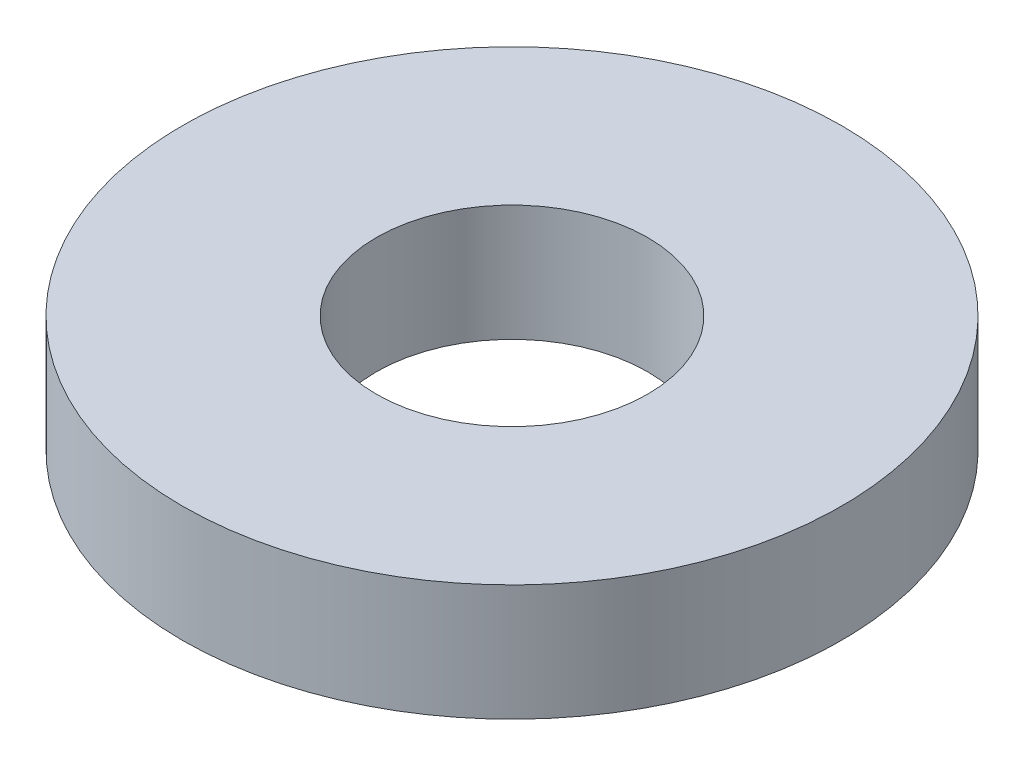
ISO-10303-21;
HEADER;
FILE_DESCRIPTION(('STEP AP214'),'2;1');
FILE_NAME('part.step','',(''),(''),'','','');
FILE_SCHEMA(('AUTOMOTIVE_DESIGN { 1 0 10303 214 1 1 1 1 }'));
ENDSEC;
DATA;
#1=APPLICATION_CONTEXT('core data for automotive mechanical design processes');
#2=APPLICATION_PROTOCOL_DEFINITION('international standard','automotive_design',2000,#1);
#3=PRODUCT_CONTEXT('',#1,'mechanical');
#4=PRODUCT('Part','Part','',(#3));
#5=PRODUCT_RELATED_PRODUCT_CATEGORY('part','',(#4));
#6=PRODUCT_DEFINITION_FORMATION('','',#4);
#7=PRODUCT_DEFINITION_CONTEXT('part definition',#1,'design');
#8=PRODUCT_DEFINITION('design','',#6,#7);
#9=PRODUCT_DEFINITION_SHAPE('','',#8);
#10=(LENGTH_UNIT() NAMED_UNIT(*) SI_UNIT(.MILLI.,.METRE.));
#11=(NAMED_UNIT(*) PLANE_ANGLE_UNIT() SI_UNIT($,.RADIAN.));
#12=(NAMED_UNIT(*) SI_UNIT($,.STERADIAN.) SOLID_ANGLE_UNIT());
#13=UNCERTAINTY_MEASURE_WITH_UNIT(LENGTH_MEASURE(1.E-05),#10,'distance_accuracy_value','');
#14=(GEOMETRIC_REPRESENTATION_CONTEXT(3) GLOBAL_UNCERTAINTY_ASSIGNED_CONTEXT((#13)) GLOBAL_UNIT_ASSIGNED_CONTEXT((#10,
#11,#12)) REPRESENTATION_CONTEXT('',''));
#15=CARTESIAN_POINT('',(0.,0.,0.));
#16=DIRECTION('',(0.,0.,1.));
#17=DIRECTION('',(1.,0.,0.));
#18=AXIS2_PLACEMENT_3D('',#15,#16,#17);
#19=CARTESIAN_POINT('',(0.,6.,0.));
#20=DIRECTION('',(0.,1.,0.));
#21=DIRECTION('',(0.,0.,1.));
#22=AXIS2_PLACEMENT_3D('',#19,#20,#21);
#23=PLANE('',#22);
#24=CARTESIAN_POINT('',(0.,6.,0.));
#25=DIRECTION('',(0.,1.,0.));
#26=DIRECTION('',(0.,0.,1.));
#27=AXIS2_PLACEMENT_3D('',#24,#25,#26);
#28=CIRCLE('',#27,17.);
#29=CARTESIAN_POINT('',(0.,6.,17.));
#30=VERTEX_POINT('',#29);
#31=EDGE_CURVE('E10',#30,#30,#28,.T.);
#32=ORIENTED_EDGE('',*,*,#31,.T.);
#33=EDGE_LOOP('',(#32));
#34=FACE_BOUND('',#33,.T.);
#35=CARTESIAN_POINT('',(0.,6.,0.));
#36=DIRECTION('',(0.,1.,0.));
#37=DIRECTION('',(0.,0.,1.));
#38=AXIS2_PLACEMENT_3D('',#35,#36,#37);
#39=CIRCLE('',#38,7.);
#40=CARTESIAN_POINT('',(0.,6.,7.));
#41=VERTEX_POINT('',#40);
#42=EDGE_CURVE('E42',#41,#41,#39,.T.);
#43=ORIENTED_EDGE('',*,*,#42,.F.);
#44=EDGE_LOOP('',(#43));
#45=FACE_BOUND('',#44,.T.);
#46=ADVANCED_FACE('F31',(#34,#45),#23,.T.);
#47=CARTESIAN_POINT('',(0.,0.,0.));
#48=DIRECTION('',(0.,1.,0.));
#49=DIRECTION('',(0.,0.,1.));
#50=AXIS2_PLACEMENT_3D('',#47,#48,#49);
#51=PLANE('',#50);
#52=CARTESIAN_POINT('',(0.,0.,0.));
#53=DIRECTION('',(0.,1.,0.));
#54=DIRECTION('',(0.,0.,1.));
#55=AXIS2_PLACEMENT_3D('',#52,#53,#54);
#56=CIRCLE('',#55,17.);
#57=CARTESIAN_POINT('',(0.,0.,17.));
#58=VERTEX_POINT('',#57);
#59=EDGE_CURVE('E35',#58,#58,#56,.T.);
#60=ORIENTED_EDGE('',*,*,#59,.F.);
#61=EDGE_LOOP('',(#60));
#62=FACE_BOUND('',#61,.T.);
#63=CARTESIAN_POINT('',(0.,0.,0.));
#64=DIRECTION('',(0.,1.,0.));
#65=DIRECTION('',(0.,0.,1.));
#66=AXIS2_PLACEMENT_3D('',#63,#64,#65);
#67=CIRCLE('',#66,7.);
#68=CARTESIAN_POINT('',(0.,0.,7.));
#69=VERTEX_POINT('',#68);
#70=EDGE_CURVE('E44',#69,#69,#67,.T.);
#71=ORIENTED_EDGE('',*,*,#70,.T.);
#72=EDGE_LOOP('',(#71));
#73=FACE_BOUND('',#72,.T.);
#74=ADVANCED_FACE('F54',(#62,#73),#51,.F.);
#75=CARTESIAN_POINT('',(0.,6.,0.));
#76=DIRECTION('',(0.,-1.,0.));
#77=DIRECTION('',(0.,0.,-1.));
#78=AXIS2_PLACEMENT_3D('',#75,#76,#77);
#79=CYLINDRICAL_SURFACE('',#78,17.);
#80=ORIENTED_EDGE('',*,*,#31,.F.);
#81=EDGE_LOOP('',(#80));
#82=FACE_BOUND('',#81,.T.);
#83=ORIENTED_EDGE('',*,*,#59,.T.);
#84=EDGE_LOOP('',(#83));
#85=FACE_BOUND('',#84,.T.);
#86=ADVANCED_FACE('F33',(#82,#85),#79,.T.);
#87=CARTESIAN_POINT('',(0.,6.,0.));
#88=DIRECTION('',(0.,-1.,0.));
#89=DIRECTION('',(0.,0.,-1.));
#90=AXIS2_PLACEMENT_3D('',#87,#88,#89);
#91=CYLINDRICAL_SURFACE('',#90,7.);
#92=ORIENTED_EDGE('',*,*,#42,.T.);
#93=EDGE_LOOP('',(#92));
#94=FACE_BOUND('',#93,.T.);
#95=ORIENTED_EDGE('',*,*,#70,.F.);
#96=EDGE_LOOP('',(#95));
#97=FACE_BOUND('',#96,.T.);
#98=ADVANCED_FACE('F50',(#94,#97),#91,.F.);
#99=CLOSED_SHELL('',(#46,#74,#86,#98));
#100=MANIFOLD_SOLID_BREP('B2',#99);
#101=ADVANCED_BREP_SHAPE_REPRESENTATION('',(#18,#100),#14);
#102=SHAPE_DEFINITION_REPRESENTATION(#9,#101);
ENDSEC;
END-ISO-10303-21;
